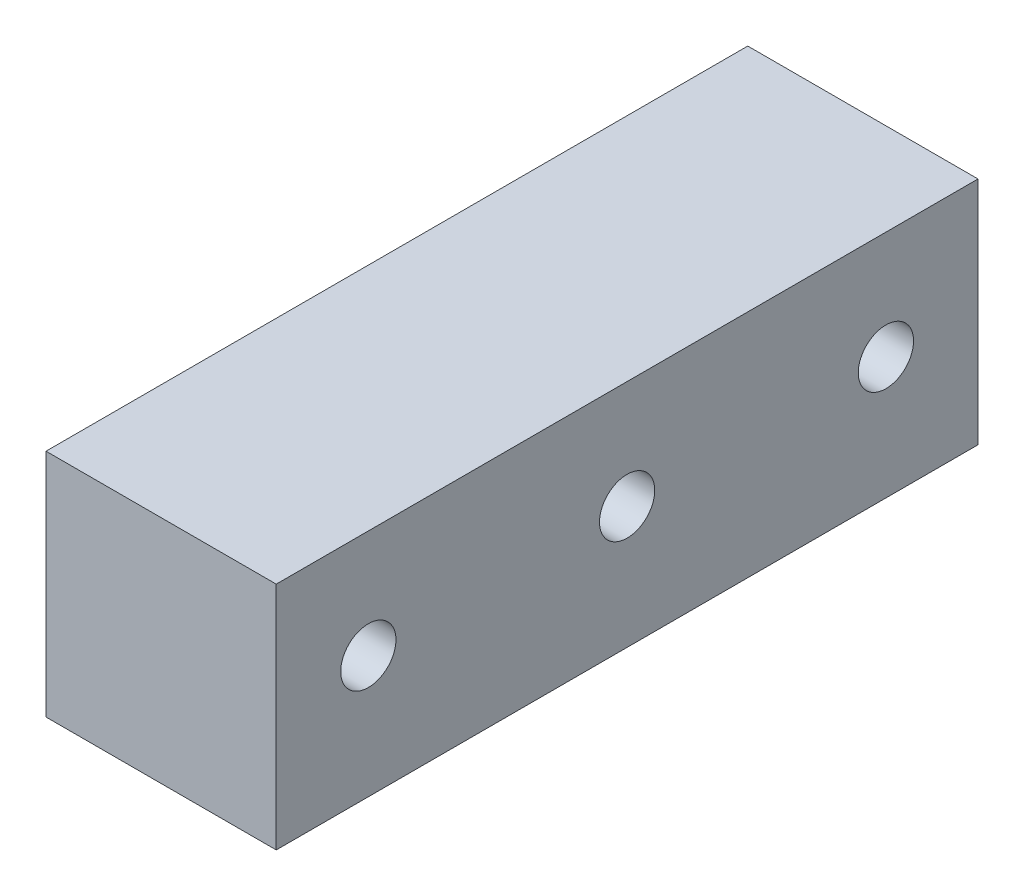
ISO-10303-21;
HEADER;
FILE_DESCRIPTION(('STEP AP214'),'2;1');
FILE_NAME('part.step','',(''),(''),'','','');
FILE_SCHEMA(('AUTOMOTIVE_DESIGN { 1 0 10303 214 1 1 1 1 }'));
ENDSEC;
DATA;
#1=APPLICATION_CONTEXT('core data for automotive mechanical design processes');
#2=APPLICATION_PROTOCOL_DEFINITION('international standard','automotive_design',2000,#1);
#3=PRODUCT_CONTEXT('',#1,'mechanical');
#4=PRODUCT('Part','Part','',(#3));
#5=PRODUCT_RELATED_PRODUCT_CATEGORY('part','',(#4));
#6=PRODUCT_DEFINITION_FORMATION('','',#4);
#7=PRODUCT_DEFINITION_CONTEXT('part definition',#1,'design');
#8=PRODUCT_DEFINITION('design','',#6,#7);
#9=PRODUCT_DEFINITION_SHAPE('','',#8);
#10=(LENGTH_UNIT() NAMED_UNIT(*) SI_UNIT(.MILLI.,.METRE.));
#11=(NAMED_UNIT(*) PLANE_ANGLE_UNIT() SI_UNIT($,.RADIAN.));
#12=(NAMED_UNIT(*) SI_UNIT($,.STERADIAN.) SOLID_ANGLE_UNIT());
#13=UNCERTAINTY_MEASURE_WITH_UNIT(LENGTH_MEASURE(1.E-05),#10,'distance_accuracy_value','');
#14=(GEOMETRIC_REPRESENTATION_CONTEXT(3) GLOBAL_UNCERTAINTY_ASSIGNED_CONTEXT((#13)) GLOBAL_UNIT_ASSIGNED_CONTEXT((#10,
#11,#12)) REPRESENTATION_CONTEXT('',''));
#15=CARTESIAN_POINT('',(0.,0.,0.));
#16=DIRECTION('',(0.,0.,1.));
#17=DIRECTION('',(1.,0.,0.));
#18=AXIS2_PLACEMENT_3D('',#15,#16,#17);
#19=CARTESIAN_POINT('',(25.,50.,-76.2));
#20=DIRECTION('',(-1.,0.,0.));
#21=DIRECTION('',(0.,0.,1.));
#22=AXIS2_PLACEMENT_3D('',#19,#20,#21);
#23=PLANE('',#22);
#24=CARTESIAN_POINT('',(25.,26.5504949345599,56.2));
#25=DIRECTION('',(1.,0.,0.));
#26=DIRECTION('',(0.,0.,-1.));
#27=AXIS2_PLACEMENT_3D('',#24,#25,#26);
#28=CIRCLE('',#27,6.);
#29=CARTESIAN_POINT('',(25.,26.5504949345599,50.2));
#30=VERTEX_POINT('',#29);
#31=EDGE_CURVE('E144',#30,#30,#28,.T.);
#32=ORIENTED_EDGE('',*,*,#31,.F.);
#33=EDGE_LOOP('',(#32));
#34=FACE_BOUND('',#33,.T.);
#35=CARTESIAN_POINT('',(25.,26.5504949345599,0.));
#36=DIRECTION('',(1.,0.,0.));
#37=DIRECTION('',(0.,0.,-1.));
#38=AXIS2_PLACEMENT_3D('',#35,#36,#37);
#39=CIRCLE('',#38,6.);
#40=CARTESIAN_POINT('',(25.,26.5504949345599,-5.99999999999999));
#41=VERTEX_POINT('',#40);
#42=EDGE_CURVE('E136',#41,#41,#39,.T.);
#43=ORIENTED_EDGE('',*,*,#42,.F.);
#44=EDGE_LOOP('',(#43));
#45=FACE_BOUND('',#44,.T.);
#46=CARTESIAN_POINT('',(25.,26.5504949345599,-56.2));
#47=DIRECTION('',(1.,0.,0.));
#48=DIRECTION('',(0.,0.,-1.));
#49=AXIS2_PLACEMENT_3D('',#46,#47,#48);
#50=CIRCLE('',#49,6.);
#51=CARTESIAN_POINT('',(25.,26.5504949345599,-62.2));
#52=VERTEX_POINT('',#51);
#53=EDGE_CURVE('E128',#52,#52,#50,.T.);
#54=ORIENTED_EDGE('',*,*,#53,.F.);
#55=EDGE_LOOP('',(#54));
#56=FACE_BOUND('',#55,.T.);
#57=DIRECTION('',(0.,0.,-1.));
#58=VECTOR('',#57,1.);
#59=CARTESIAN_POINT('',(25.,0.,-76.2));
#60=LINE('',#59,#58);
#61=CARTESIAN_POINT('',(25.,0.,76.2));
#62=VERTEX_POINT('',#61);
#63=CARTESIAN_POINT('',(25.,0.,-76.2));
#64=VERTEX_POINT('',#63);
#65=EDGE_CURVE('E107',#62,#64,#60,.T.);
#66=ORIENTED_EDGE('',*,*,#65,.T.);
#67=DIRECTION('',(0.,-1.,0.));
#68=VECTOR('',#67,1.);
#69=CARTESIAN_POINT('',(25.,50.,-76.2));
#70=LINE('',#69,#68);
#71=CARTESIAN_POINT('',(25.,50.,-76.2));
#72=VERTEX_POINT('',#71);
#73=EDGE_CURVE('E11',#72,#64,#70,.T.);
#74=ORIENTED_EDGE('',*,*,#73,.F.);
#75=DIRECTION('',(0.,0.,-1.));
#76=VECTOR('',#75,1.);
#77=CARTESIAN_POINT('',(25.,50.,-76.2));
#78=LINE('',#77,#76);
#79=CARTESIAN_POINT('',(25.,50.,76.2));
#80=VERTEX_POINT('',#79);
#81=EDGE_CURVE('E91',#80,#72,#78,.T.);
#82=ORIENTED_EDGE('',*,*,#81,.F.);
#83=DIRECTION('',(0.,-1.,0.));
#84=VECTOR('',#83,1.);
#85=CARTESIAN_POINT('',(25.,50.,76.2));
#86=LINE('',#85,#84);
#87=EDGE_CURVE('E103',#80,#62,#86,.T.);
#88=ORIENTED_EDGE('',*,*,#87,.T.);
#89=EDGE_LOOP('',(#66,#74,#82,#88));
#90=FACE_BOUND('',#89,.T.);
#91=ADVANCED_FACE('F39',(#34,#45,#56,#90),#23,.F.);
#92=CARTESIAN_POINT('',(-25.,50.,-76.2));
#93=DIRECTION('',(0.,0.,1.));
#94=DIRECTION('',(1.,0.,0.));
#95=AXIS2_PLACEMENT_3D('',#92,#93,#94);
#96=PLANE('',#95);
#97=DIRECTION('',(-1.,0.,0.));
#98=VECTOR('',#97,1.);
#99=CARTESIAN_POINT('',(-25.,0.,-76.2));
#100=LINE('',#99,#98);
#101=CARTESIAN_POINT('',(-25.,0.,-76.2));
#102=VERTEX_POINT('',#101);
#103=EDGE_CURVE('E96',#64,#102,#100,.T.);
#104=ORIENTED_EDGE('',*,*,#103,.T.);
#105=DIRECTION('',(0.,-1.,0.));
#106=VECTOR('',#105,1.);
#107=CARTESIAN_POINT('',(-25.,50.,-76.2));
#108=LINE('',#107,#106);
#109=CARTESIAN_POINT('',(-25.,50.,-76.2));
#110=VERTEX_POINT('',#109);
#111=EDGE_CURVE('E48',#110,#102,#108,.T.);
#112=ORIENTED_EDGE('',*,*,#111,.F.);
#113=DIRECTION('',(-1.,0.,0.));
#114=VECTOR('',#113,1.);
#115=CARTESIAN_POINT('',(-25.,50.,-76.2));
#116=LINE('',#115,#114);
#117=EDGE_CURVE('E86',#72,#110,#116,.T.);
#118=ORIENTED_EDGE('',*,*,#117,.F.);
#119=ORIENTED_EDGE('',*,*,#73,.T.);
#120=EDGE_LOOP('',(#104,#112,#118,#119));
#121=FACE_BOUND('',#120,.T.);
#122=ADVANCED_FACE('F95',(#121),#96,.F.);
#123=CARTESIAN_POINT('',(-25.,50.,-76.2));
#124=DIRECTION('',(1.,0.,0.));
#125=DIRECTION('',(0.,0.,-1.));
#126=AXIS2_PLACEMENT_3D('',#123,#124,#125);
#127=PLANE('',#126);
#128=CARTESIAN_POINT('',(-25.,26.5504949345599,56.2));
#129=DIRECTION('',(1.,0.,0.));
#130=DIRECTION('',(0.,0.,-1.));
#131=AXIS2_PLACEMENT_3D('',#128,#129,#130);
#132=CIRCLE('',#131,6.);
#133=CARTESIAN_POINT('',(-25.,26.5504949345599,50.2));
#134=VERTEX_POINT('',#133);
#135=EDGE_CURVE('E111',#134,#134,#132,.T.);
#136=ORIENTED_EDGE('',*,*,#135,.T.);
#137=EDGE_LOOP('',(#136));
#138=FACE_BOUND('',#137,.T.);
#139=CARTESIAN_POINT('',(-25.,26.5504949345599,0.));
#140=DIRECTION('',(1.,0.,0.));
#141=DIRECTION('',(0.,0.,-1.));
#142=AXIS2_PLACEMENT_3D('',#139,#140,#141);
#143=CIRCLE('',#142,6.);
#144=CARTESIAN_POINT('',(-25.,26.5504949345599,-5.99999999999999));
#145=VERTEX_POINT('',#144);
#146=EDGE_CURVE('E140',#145,#145,#143,.T.);
#147=ORIENTED_EDGE('',*,*,#146,.T.);
#148=EDGE_LOOP('',(#147));
#149=FACE_BOUND('',#148,.T.);
#150=CARTESIAN_POINT('',(-25.,26.5504949345599,-56.2));
#151=DIRECTION('',(1.,0.,0.));
#152=DIRECTION('',(0.,0.,-1.));
#153=AXIS2_PLACEMENT_3D('',#150,#151,#152);
#154=CIRCLE('',#153,6.);
#155=CARTESIAN_POINT('',(-25.,26.5504949345599,-62.2));
#156=VERTEX_POINT('',#155);
#157=EDGE_CURVE('E132',#156,#156,#154,.T.);
#158=ORIENTED_EDGE('',*,*,#157,.T.);
#159=EDGE_LOOP('',(#158));
#160=FACE_BOUND('',#159,.T.);
#161=DIRECTION('',(0.,0.,1.));
#162=VECTOR('',#161,1.);
#163=CARTESIAN_POINT('',(-25.,0.,-76.2));
#164=LINE('',#163,#162);
#165=CARTESIAN_POINT('',(-25.,0.,76.2));
#166=VERTEX_POINT('',#165);
#167=EDGE_CURVE('E73',#102,#166,#164,.T.);
#168=ORIENTED_EDGE('',*,*,#167,.T.);
#169=DIRECTION('',(0.,-1.,0.));
#170=VECTOR('',#169,1.);
#171=CARTESIAN_POINT('',(-25.,50.,76.2));
#172=LINE('',#171,#170);
#173=CARTESIAN_POINT('',(-25.,50.,76.2));
#174=VERTEX_POINT('',#173);
#175=EDGE_CURVE('E98',#174,#166,#172,.T.);
#176=ORIENTED_EDGE('',*,*,#175,.F.);
#177=DIRECTION('',(0.,0.,1.));
#178=VECTOR('',#177,1.);
#179=CARTESIAN_POINT('',(-25.,50.,-76.2));
#180=LINE('',#179,#178);
#181=EDGE_CURVE('E89',#110,#174,#180,.T.);
#182=ORIENTED_EDGE('',*,*,#181,.F.);
#183=ORIENTED_EDGE('',*,*,#111,.T.);
#184=EDGE_LOOP('',(#168,#176,#182,#183));
#185=FACE_BOUND('',#184,.T.);
#186=ADVANCED_FACE('F99',(#138,#149,#160,#185),#127,.F.);
#187=CARTESIAN_POINT('',(-25.,50.,76.2));
#188=DIRECTION('',(0.,0.,-1.));
#189=DIRECTION('',(-1.,0.,0.));
#190=AXIS2_PLACEMENT_3D('',#187,#188,#189);
#191=PLANE('',#190);
#192=DIRECTION('',(1.,0.,0.));
#193=VECTOR('',#192,1.);
#194=CARTESIAN_POINT('',(-25.,0.,76.2));
#195=LINE('',#194,#193);
#196=EDGE_CURVE('E79',#166,#62,#195,.T.);
#197=ORIENTED_EDGE('',*,*,#196,.T.);
#198=ORIENTED_EDGE('',*,*,#87,.F.);
#199=DIRECTION('',(1.,0.,0.));
#200=VECTOR('',#199,1.);
#201=CARTESIAN_POINT('',(-25.,50.,76.2));
#202=LINE('',#201,#200);
#203=EDGE_CURVE('E56',#174,#80,#202,.T.);
#204=ORIENTED_EDGE('',*,*,#203,.F.);
#205=ORIENTED_EDGE('',*,*,#175,.T.);
#206=EDGE_LOOP('',(#197,#198,#204,#205));
#207=FACE_BOUND('',#206,.T.);
#208=ADVANCED_FACE('F121',(#207),#191,.F.);
#209=CARTESIAN_POINT('',(0.,50.,0.));
#210=DIRECTION('',(0.,1.,0.));
#211=DIRECTION('',(0.,0.,1.));
#212=AXIS2_PLACEMENT_3D('',#209,#210,#211);
#213=PLANE('',#212);
#214=ORIENTED_EDGE('',*,*,#81,.T.);
#215=ORIENTED_EDGE('',*,*,#117,.T.);
#216=ORIENTED_EDGE('',*,*,#181,.T.);
#217=ORIENTED_EDGE('',*,*,#203,.T.);
#218=EDGE_LOOP('',(#214,#215,#216,#217));
#219=FACE_BOUND('',#218,.T.);
#220=ADVANCED_FACE('F87',(#219),#213,.T.);
#221=CARTESIAN_POINT('',(0.,0.,0.));
#222=DIRECTION('',(0.,1.,0.));
#223=DIRECTION('',(0.,0.,1.));
#224=AXIS2_PLACEMENT_3D('',#221,#222,#223);
#225=PLANE('',#224);
#226=ORIENTED_EDGE('',*,*,#65,.F.);
#227=ORIENTED_EDGE('',*,*,#196,.F.);
#228=ORIENTED_EDGE('',*,*,#167,.F.);
#229=ORIENTED_EDGE('',*,*,#103,.F.);
#230=EDGE_LOOP('',(#226,#227,#228,#229));
#231=FACE_BOUND('',#230,.T.);
#232=ADVANCED_FACE('F124',(#231),#225,.F.);
#233=CARTESIAN_POINT('',(-25.,26.5504949345599,-56.2));
#234=DIRECTION('',(1.,0.,0.));
#235=DIRECTION('',(0.,0.,-1.));
#236=AXIS2_PLACEMENT_3D('',#233,#234,#235);
#237=CYLINDRICAL_SURFACE('',#236,6.);
#238=ORIENTED_EDGE('',*,*,#157,.F.);
#239=EDGE_LOOP('',(#238));
#240=FACE_BOUND('',#239,.T.);
#241=ORIENTED_EDGE('',*,*,#53,.T.);
#242=EDGE_LOOP('',(#241));
#243=FACE_BOUND('',#242,.T.);
#244=ADVANCED_FACE('F167',(#240,#243),#237,.F.);
#245=CARTESIAN_POINT('',(-25.,26.5504949345599,0.));
#246=DIRECTION('',(1.,0.,0.));
#247=DIRECTION('',(0.,0.,-1.));
#248=AXIS2_PLACEMENT_3D('',#245,#246,#247);
#249=CYLINDRICAL_SURFACE('',#248,6.);
#250=ORIENTED_EDGE('',*,*,#146,.F.);
#251=EDGE_LOOP('',(#250));
#252=FACE_BOUND('',#251,.T.);
#253=ORIENTED_EDGE('',*,*,#42,.T.);
#254=EDGE_LOOP('',(#253));
#255=FACE_BOUND('',#254,.T.);
#256=ADVANCED_FACE('F157',(#252,#255),#249,.F.);
#257=CARTESIAN_POINT('',(-25.,26.5504949345599,56.2));
#258=DIRECTION('',(1.,0.,0.));
#259=DIRECTION('',(0.,0.,-1.));
#260=AXIS2_PLACEMENT_3D('',#257,#258,#259);
#261=CYLINDRICAL_SURFACE('',#260,6.);
#262=ORIENTED_EDGE('',*,*,#135,.F.);
#263=EDGE_LOOP('',(#262));
#264=FACE_BOUND('',#263,.T.);
#265=ORIENTED_EDGE('',*,*,#31,.T.);
#266=EDGE_LOOP('',(#265));
#267=FACE_BOUND('',#266,.T.);
#268=ADVANCED_FACE('F154',(#264,#267),#261,.F.);
#269=CLOSED_SHELL('',(#91,#122,#186,#208,#220,#232,#244,#256,#268));
#270=MANIFOLD_SOLID_BREP('B2',#269);
#271=ADVANCED_BREP_SHAPE_REPRESENTATION('',(#18,#270),#14);
#272=SHAPE_DEFINITION_REPRESENTATION(#9,#271);
ENDSEC;
END-ISO-10303-21;
